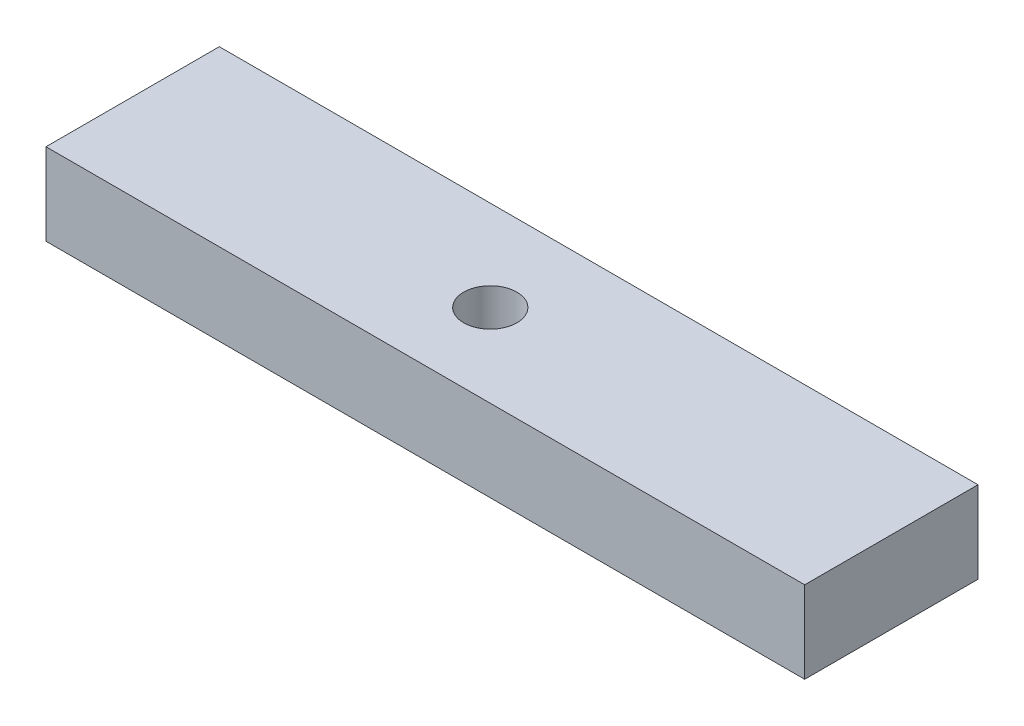
ISO-10303-21;
HEADER;
FILE_DESCRIPTION(('STEP AP214'),'2;1');
FILE_NAME('part.step','',(''),(''),'','','');
FILE_SCHEMA(('AUTOMOTIVE_DESIGN { 1 0 10303 214 1 1 1 1 }'));
ENDSEC;
DATA;
#1=APPLICATION_CONTEXT('core data for automotive mechanical design processes');
#2=APPLICATION_PROTOCOL_DEFINITION('international standard','automotive_design',2000,#1);
#3=PRODUCT_CONTEXT('',#1,'mechanical');
#4=PRODUCT('Part','Part','',(#3));
#5=PRODUCT_RELATED_PRODUCT_CATEGORY('part','',(#4));
#6=PRODUCT_DEFINITION_FORMATION('','',#4);
#7=PRODUCT_DEFINITION_CONTEXT('part definition',#1,'design');
#8=PRODUCT_DEFINITION('design','',#6,#7);
#9=PRODUCT_DEFINITION_SHAPE('','',#8);
#10=(LENGTH_UNIT() NAMED_UNIT(*) SI_UNIT(.MILLI.,.METRE.));
#11=(NAMED_UNIT(*) PLANE_ANGLE_UNIT() SI_UNIT($,.RADIAN.));
#12=(NAMED_UNIT(*) SI_UNIT($,.STERADIAN.) SOLID_ANGLE_UNIT());
#13=UNCERTAINTY_MEASURE_WITH_UNIT(LENGTH_MEASURE(1.E-05),#10,'distance_accuracy_value','');
#14=(GEOMETRIC_REPRESENTATION_CONTEXT(3) GLOBAL_UNCERTAINTY_ASSIGNED_CONTEXT((#13)) GLOBAL_UNIT_ASSIGNED_CONTEXT((#10,
#11,#12)) REPRESENTATION_CONTEXT('',''));
#15=CARTESIAN_POINT('',(0.,0.,0.));
#16=DIRECTION('',(0.,0.,1.));
#17=DIRECTION('',(1.,0.,0.));
#18=AXIS2_PLACEMENT_3D('',#15,#16,#17);
#19=CARTESIAN_POINT('',(-21.0079545454546,6.,0.));
#20=DIRECTION('',(1.,0.,0.));
#21=DIRECTION('',(0.,0.,-1.));
#22=AXIS2_PLACEMENT_3D('',#19,#20,#21);
#23=PLANE('',#22);
#24=DIRECTION('',(0.,0.,1.));
#25=VECTOR('',#24,1.);
#26=CARTESIAN_POINT('',(-21.0079545454546,0.,0.));
#27=LINE('',#26,#25);
#28=CARTESIAN_POINT('',(-21.0079545454546,0.,0.));
#29=VERTEX_POINT('',#28);
#30=CARTESIAN_POINT('',(-21.0079545454546,0.,12.7));
#31=VERTEX_POINT('',#30);
#32=EDGE_CURVE('E96',#29,#31,#27,.T.);
#33=ORIENTED_EDGE('',*,*,#32,.T.);
#34=DIRECTION('',(0.,-1.,0.));
#35=VECTOR('',#34,1.);
#36=CARTESIAN_POINT('',(-21.0079545454546,6.,12.7));
#37=LINE('',#36,#35);
#38=CARTESIAN_POINT('',(-21.0079545454546,6.,12.7));
#39=VERTEX_POINT('',#38);
#40=EDGE_CURVE('E11',#39,#31,#37,.T.);
#41=ORIENTED_EDGE('',*,*,#40,.F.);
#42=DIRECTION('',(0.,0.,1.));
#43=VECTOR('',#42,1.);
#44=CARTESIAN_POINT('',(-21.0079545454546,6.,0.));
#45=LINE('',#44,#43);
#46=CARTESIAN_POINT('',(-21.0079545454546,6.,0.));
#47=VERTEX_POINT('',#46);
#48=EDGE_CURVE('E84',#47,#39,#45,.T.);
#49=ORIENTED_EDGE('',*,*,#48,.F.);
#50=DIRECTION('',(0.,-1.,0.));
#51=VECTOR('',#50,1.);
#52=CARTESIAN_POINT('',(-21.0079545454546,6.,0.));
#53=LINE('',#52,#51);
#54=EDGE_CURVE('E92',#47,#29,#53,.T.);
#55=ORIENTED_EDGE('',*,*,#54,.T.);
#56=EDGE_LOOP('',(#33,#41,#49,#55));
#57=FACE_BOUND('',#56,.T.);
#58=ADVANCED_FACE('F33',(#57),#23,.F.);
#59=CARTESIAN_POINT('',(-21.0079545454546,6.,12.7));
#60=DIRECTION('',(0.,0.,-1.));
#61=DIRECTION('',(-1.,0.,0.));
#62=AXIS2_PLACEMENT_3D('',#59,#60,#61);
#63=PLANE('',#62);
#64=DIRECTION('',(1.,0.,0.));
#65=VECTOR('',#64,1.);
#66=CARTESIAN_POINT('',(-21.0079545454546,0.,12.7));
#67=LINE('',#66,#65);
#68=CARTESIAN_POINT('',(34.5920454545455,0.,12.7));
#69=VERTEX_POINT('',#68);
#70=EDGE_CURVE('E88',#31,#69,#67,.T.);
#71=ORIENTED_EDGE('',*,*,#70,.T.);
#72=DIRECTION('',(0.,-1.,0.));
#73=VECTOR('',#72,1.);
#74=CARTESIAN_POINT('',(34.5920454545455,6.,12.7));
#75=LINE('',#74,#73);
#76=CARTESIAN_POINT('',(34.5920454545455,6.,12.7));
#77=VERTEX_POINT('',#76);
#78=EDGE_CURVE('E41',#77,#69,#75,.T.);
#79=ORIENTED_EDGE('',*,*,#78,.F.);
#80=DIRECTION('',(1.,0.,0.));
#81=VECTOR('',#80,1.);
#82=CARTESIAN_POINT('',(-21.0079545454546,6.,12.7));
#83=LINE('',#82,#81);
#84=EDGE_CURVE('E79',#39,#77,#83,.T.);
#85=ORIENTED_EDGE('',*,*,#84,.F.);
#86=ORIENTED_EDGE('',*,*,#40,.T.);
#87=EDGE_LOOP('',(#71,#79,#85,#86));
#88=FACE_BOUND('',#87,.T.);
#89=ADVANCED_FACE('F87',(#88),#63,.F.);
#90=CARTESIAN_POINT('',(34.5920454545455,6.,0.));
#91=DIRECTION('',(-1.,0.,0.));
#92=DIRECTION('',(0.,0.,1.));
#93=AXIS2_PLACEMENT_3D('',#90,#91,#92);
#94=PLANE('',#93);
#95=DIRECTION('',(0.,0.,-1.));
#96=VECTOR('',#95,1.);
#97=CARTESIAN_POINT('',(34.5920454545455,0.,0.));
#98=LINE('',#97,#96);
#99=CARTESIAN_POINT('',(34.5920454545455,0.,0.));
#100=VERTEX_POINT('',#99);
#101=EDGE_CURVE('E66',#69,#100,#98,.T.);
#102=ORIENTED_EDGE('',*,*,#101,.T.);
#103=DIRECTION('',(0.,-1.,0.));
#104=VECTOR('',#103,1.);
#105=CARTESIAN_POINT('',(34.5920454545455,6.,0.));
#106=LINE('',#105,#104);
#107=CARTESIAN_POINT('',(34.5920454545455,6.,0.));
#108=VERTEX_POINT('',#107);
#109=EDGE_CURVE('E89',#108,#100,#106,.T.);
#110=ORIENTED_EDGE('',*,*,#109,.F.);
#111=DIRECTION('',(0.,0.,-1.));
#112=VECTOR('',#111,1.);
#113=CARTESIAN_POINT('',(34.5920454545455,6.,0.));
#114=LINE('',#113,#112);
#115=EDGE_CURVE('E82',#77,#108,#114,.T.);
#116=ORIENTED_EDGE('',*,*,#115,.F.);
#117=ORIENTED_EDGE('',*,*,#78,.T.);
#118=EDGE_LOOP('',(#102,#110,#116,#117));
#119=FACE_BOUND('',#118,.T.);
#120=ADVANCED_FACE('F90',(#119),#94,.F.);
#121=CARTESIAN_POINT('',(-21.0079545454546,6.,0.));
#122=DIRECTION('',(0.,0.,1.));
#123=DIRECTION('',(1.,0.,0.));
#124=AXIS2_PLACEMENT_3D('',#121,#122,#123);
#125=PLANE('',#124);
#126=DIRECTION('',(-1.,0.,0.));
#127=VECTOR('',#126,1.);
#128=CARTESIAN_POINT('',(-21.0079545454546,0.,0.));
#129=LINE('',#128,#127);
#130=EDGE_CURVE('E72',#100,#29,#129,.T.);
#131=ORIENTED_EDGE('',*,*,#130,.T.);
#132=ORIENTED_EDGE('',*,*,#54,.F.);
#133=DIRECTION('',(-1.,0.,0.));
#134=VECTOR('',#133,1.);
#135=CARTESIAN_POINT('',(-21.0079545454546,6.,0.));
#136=LINE('',#135,#134);
#137=EDGE_CURVE('E49',#108,#47,#136,.T.);
#138=ORIENTED_EDGE('',*,*,#137,.F.);
#139=ORIENTED_EDGE('',*,*,#109,.T.);
#140=EDGE_LOOP('',(#131,#132,#138,#139));
#141=FACE_BOUND('',#140,.T.);
#142=ADVANCED_FACE('F104',(#141),#125,.F.);
#143=CARTESIAN_POINT('',(0.,6.,0.));
#144=DIRECTION('',(0.,1.,0.));
#145=DIRECTION('',(0.,0.,1.));
#146=AXIS2_PLACEMENT_3D('',#143,#144,#145);
#147=PLANE('',#146);
#148=CARTESIAN_POINT('',(5.47161459567008,6.,6.62085761207698));
#149=DIRECTION('',(0.,1.,0.));
#150=DIRECTION('',(0.,0.,1.));
#151=AXIS2_PLACEMENT_3D('',#148,#149,#150);
#152=CIRCLE('',#151,1.95);
#153=CARTESIAN_POINT('',(5.47161459567008,6.,8.57085761207698));
#154=VERTEX_POINT('',#153);
#155=EDGE_CURVE('E112',#154,#154,#152,.T.);
#156=ORIENTED_EDGE('',*,*,#155,.F.);
#157=EDGE_LOOP('',(#156));
#158=FACE_BOUND('',#157,.T.);
#159=ORIENTED_EDGE('',*,*,#48,.T.);
#160=ORIENTED_EDGE('',*,*,#84,.T.);
#161=ORIENTED_EDGE('',*,*,#115,.T.);
#162=ORIENTED_EDGE('',*,*,#137,.T.);
#163=EDGE_LOOP('',(#159,#160,#161,#162));
#164=FACE_BOUND('',#163,.T.);
#165=ADVANCED_FACE('F80',(#158,#164),#147,.T.);
#166=CARTESIAN_POINT('',(0.,0.,0.));
#167=DIRECTION('',(0.,1.,0.));
#168=DIRECTION('',(0.,0.,1.));
#169=AXIS2_PLACEMENT_3D('',#166,#167,#168);
#170=PLANE('',#169);
#171=CARTESIAN_POINT('',(5.47161459567008,0.,6.62085761207698));
#172=DIRECTION('',(0.,1.,0.));
#173=DIRECTION('',(0.,0.,1.));
#174=AXIS2_PLACEMENT_3D('',#171,#172,#173);
#175=CIRCLE('',#174,1.95);
#176=CARTESIAN_POINT('',(5.47161459567008,0.,8.57085761207698));
#177=VERTEX_POINT('',#176);
#178=EDGE_CURVE('E99',#177,#177,#175,.F.);
#179=ORIENTED_EDGE('',*,*,#178,.F.);
#180=EDGE_LOOP('',(#179));
#181=FACE_BOUND('',#180,.T.);
#182=ORIENTED_EDGE('',*,*,#32,.F.);
#183=ORIENTED_EDGE('',*,*,#130,.F.);
#184=ORIENTED_EDGE('',*,*,#101,.F.);
#185=ORIENTED_EDGE('',*,*,#70,.F.);
#186=EDGE_LOOP('',(#182,#183,#184,#185));
#187=FACE_BOUND('',#186,.T.);
#188=ADVANCED_FACE('F107',(#181,#187),#170,.F.);
#189=CARTESIAN_POINT('',(5.47161459567008,-5.51543289325507,6.62085761207698));
#190=DIRECTION('',(0.,1.,0.));
#191=DIRECTION('',(0.,0.,1.));
#192=AXIS2_PLACEMENT_3D('',#189,#190,#191);
#193=CYLINDRICAL_SURFACE('',#192,1.95);
#194=ORIENTED_EDGE('',*,*,#178,.T.);
#195=EDGE_LOOP('',(#194));
#196=FACE_BOUND('',#195,.T.);
#197=ORIENTED_EDGE('',*,*,#155,.T.);
#198=EDGE_LOOP('',(#197));
#199=FACE_BOUND('',#198,.T.);
#200=ADVANCED_FACE('F116',(#196,#199),#193,.F.);
#201=CLOSED_SHELL('',(#58,#89,#120,#142,#165,#188,#200));
#202=MANIFOLD_SOLID_BREP('B2',#201);
#203=ADVANCED_BREP_SHAPE_REPRESENTATION('',(#18,#202),#14);
#204=SHAPE_DEFINITION_REPRESENTATION(#9,#203);
ENDSEC;
END-ISO-10303-21;
